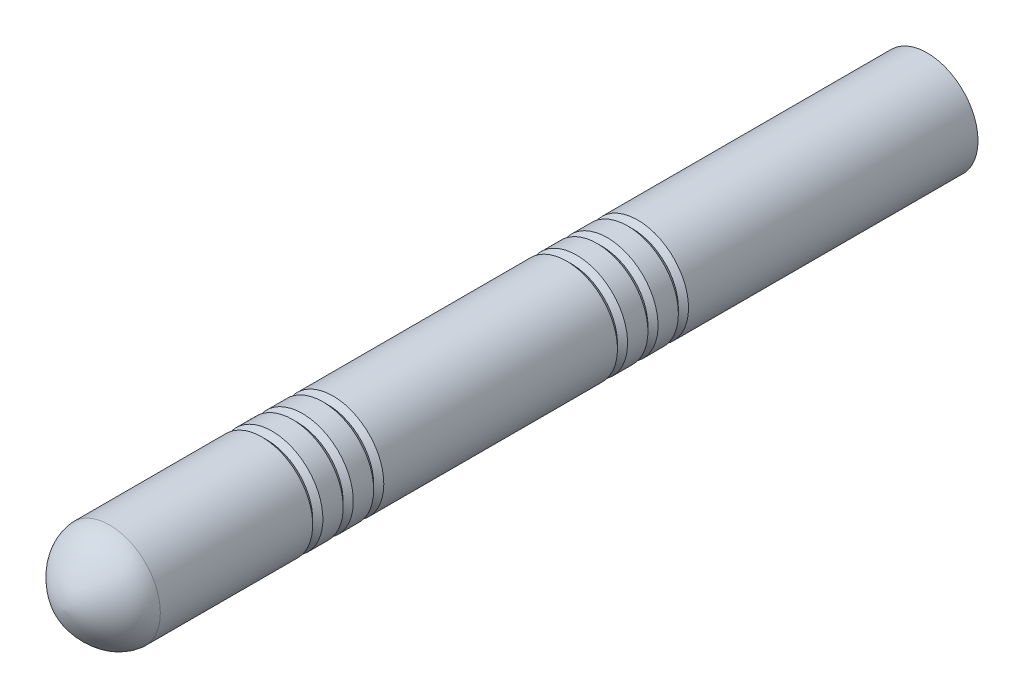
ISO-10303-21;
HEADER;
FILE_DESCRIPTION(('STEP AP214'),'2;1');
FILE_NAME('part.step','',(''),(''),'','','');
FILE_SCHEMA(('AUTOMOTIVE_DESIGN { 1 0 10303 214 1 1 1 1 }'));
ENDSEC;
DATA;
#1=APPLICATION_CONTEXT('core data for automotive mechanical design processes');
#2=APPLICATION_PROTOCOL_DEFINITION('international standard','automotive_design',2000,#1);
#3=PRODUCT_CONTEXT('',#1,'mechanical');
#4=PRODUCT('Part','Part','',(#3));
#5=PRODUCT_RELATED_PRODUCT_CATEGORY('part','',(#4));
#6=PRODUCT_DEFINITION_FORMATION('','',#4);
#7=PRODUCT_DEFINITION_CONTEXT('part definition',#1,'design');
#8=PRODUCT_DEFINITION('design','',#6,#7);
#9=PRODUCT_DEFINITION_SHAPE('','',#8);
#10=(LENGTH_UNIT() NAMED_UNIT(*) SI_UNIT(.MILLI.,.METRE.));
#11=(NAMED_UNIT(*) PLANE_ANGLE_UNIT() SI_UNIT($,.RADIAN.));
#12=(NAMED_UNIT(*) SI_UNIT($,.STERADIAN.) SOLID_ANGLE_UNIT());
#13=UNCERTAINTY_MEASURE_WITH_UNIT(LENGTH_MEASURE(1.E-05),#10,'distance_accuracy_value','');
#14=(GEOMETRIC_REPRESENTATION_CONTEXT(3) GLOBAL_UNCERTAINTY_ASSIGNED_CONTEXT((#13)) GLOBAL_UNIT_ASSIGNED_CONTEXT((#10,
#11,#12)) REPRESENTATION_CONTEXT('',''));
#15=CARTESIAN_POINT('',(0.,0.,0.));
#16=DIRECTION('',(0.,0.,1.));
#17=DIRECTION('',(1.,0.,0.));
#18=AXIS2_PLACEMENT_3D('',#15,#16,#17);
#19=CARTESIAN_POINT('',(0.,0.,80.5));
#20=DIRECTION('',(0.,0.,-1.));
#21=DIRECTION('',(-1.,0.,0.));
#22=AXIS2_PLACEMENT_3D('',#19,#20,#21);
#23=CYLINDRICAL_SURFACE('',#22,5.);
#24=CARTESIAN_POINT('',(0.,0.,35.5));
#25=DIRECTION('',(0.,0.,-1.));
#26=DIRECTION('',(-1.,0.,0.));
#27=AXIS2_PLACEMENT_3D('',#24,#25,#26);
#28=CIRCLE('',#27,5.);
#29=CARTESIAN_POINT('',(-5.,0.,35.5));
#30=VERTEX_POINT('',#29);
#31=EDGE_CURVE('E206',#30,#30,#28,.T.);
#32=ORIENTED_EDGE('',*,*,#31,.F.);
#33=EDGE_LOOP('',(#32));
#34=FACE_BOUND('',#33,.T.);
#35=CARTESIAN_POINT('',(0.,0.,58.5));
#36=DIRECTION('',(0.,0.,1.));
#37=DIRECTION('',(1.,0.,0.));
#38=AXIS2_PLACEMENT_3D('',#35,#36,#37);
#39=CIRCLE('',#38,5.);
#40=CARTESIAN_POINT('',(5.,0.,58.5));
#41=VERTEX_POINT('',#40);
#42=EDGE_CURVE('E191',#41,#41,#39,.T.);
#43=ORIENTED_EDGE('',*,*,#42,.F.);
#44=EDGE_LOOP('',(#43));
#45=FACE_BOUND('',#44,.T.);
#46=ADVANCED_FACE('F43',(#34,#45),#23,.T.);
#47=CARTESIAN_POINT('',(0.,0.,31.5));
#48=DIRECTION('',(0.,0.,-1.));
#49=DIRECTION('',(-1.,0.,0.));
#50=AXIS2_PLACEMENT_3D('',#47,#48,#49);
#51=CIRCLE('',#50,5.);
#52=CARTESIAN_POINT('',(-5.,0.,31.5));
#53=VERTEX_POINT('',#52);
#54=EDGE_CURVE('E209',#53,#53,#51,.T.);
#55=ORIENTED_EDGE('',*,*,#54,.T.);
#56=EDGE_LOOP('',(#55));
#57=FACE_BOUND('',#56,.T.);
#58=CARTESIAN_POINT('',(0.,0.,29.5));
#59=DIRECTION('',(0.,0.,1.));
#60=DIRECTION('',(1.,0.,0.));
#61=AXIS2_PLACEMENT_3D('',#58,#59,#60);
#62=CIRCLE('',#61,5.);
#63=CARTESIAN_POINT('',(5.,0.,29.5));
#64=VERTEX_POINT('',#63);
#65=EDGE_CURVE('E224',#64,#64,#62,.T.);
#66=ORIENTED_EDGE('',*,*,#65,.T.);
#67=EDGE_LOOP('',(#66));
#68=FACE_BOUND('',#67,.T.);
#69=ADVANCED_FACE('F45',(#57,#68),#23,.T.);
#70=CARTESIAN_POINT('',(0.,0.,29.5));
#71=DIRECTION('',(0.,0.,1.));
#72=DIRECTION('',(1.,0.,0.));
#73=AXIS2_PLACEMENT_3D('',#70,#71,#72);
#74=CONICAL_SURFACE('',#73,5.,0.785398163397449);
#75=CARTESIAN_POINT('',(0.,0.,29.));
#76=DIRECTION('',(0.,0.,1.));
#77=DIRECTION('',(1.,0.,0.));
#78=AXIS2_PLACEMENT_3D('',#75,#76,#77);
#79=CIRCLE('',#78,4.5);
#80=CARTESIAN_POINT('',(4.5,0.,29.));
#81=VERTEX_POINT('',#80);
#82=EDGE_CURVE('E221',#81,#81,#79,.T.);
#83=ORIENTED_EDGE('',*,*,#82,.T.);
#84=EDGE_LOOP('',(#83));
#85=FACE_BOUND('',#84,.T.);
#86=ORIENTED_EDGE('',*,*,#65,.F.);
#87=EDGE_LOOP('',(#86));
#88=FACE_BOUND('',#87,.T.);
#89=ADVANCED_FACE('F136',(#85,#88),#74,.T.);
#90=CARTESIAN_POINT('',(0.,0.,29.));
#91=DIRECTION('',(0.,0.,-1.));
#92=DIRECTION('',(-1.,0.,0.));
#93=AXIS2_PLACEMENT_3D('',#90,#91,#92);
#94=CONICAL_SURFACE('',#93,4.5,0.785398163397449);
#95=CARTESIAN_POINT('',(0.,0.,28.5));
#96=DIRECTION('',(0.,0.,1.));
#97=DIRECTION('',(1.,0.,0.));
#98=AXIS2_PLACEMENT_3D('',#95,#96,#97);
#99=CIRCLE('',#98,5.);
#100=CARTESIAN_POINT('',(5.,0.,28.5));
#101=VERTEX_POINT('',#100);
#102=EDGE_CURVE('E218',#101,#101,#99,.T.);
#103=ORIENTED_EDGE('',*,*,#102,.T.);
#104=EDGE_LOOP('',(#103));
#105=FACE_BOUND('',#104,.T.);
#106=ORIENTED_EDGE('',*,*,#82,.F.);
#107=EDGE_LOOP('',(#106));
#108=FACE_BOUND('',#107,.T.);
#109=ADVANCED_FACE('F132',(#105,#108),#94,.T.);
#110=CARTESIAN_POINT('',(0.,0.,0.));
#111=DIRECTION('',(0.,0.,1.));
#112=DIRECTION('',(1.,0.,0.));
#113=AXIS2_PLACEMENT_3D('',#110,#111,#112);
#114=PLANE('',#113);
#115=CARTESIAN_POINT('',(0.,0.,0.));
#116=DIRECTION('',(0.,0.,-1.));
#117=DIRECTION('',(-1.,0.,0.));
#118=AXIS2_PLACEMENT_3D('',#115,#116,#117);
#119=CIRCLE('',#118,3.39999999999999);
#120=CARTESIAN_POINT('',(-3.39999999999999,0.,0.));
#121=VERTEX_POINT('',#120);
#122=EDGE_CURVE('E68',#121,#121,#119,.T.);
#123=ORIENTED_EDGE('',*,*,#122,.F.);
#124=EDGE_LOOP('',(#123));
#125=FACE_BOUND('',#124,.T.);
#126=CARTESIAN_POINT('',(0.,0.,0.));
#127=DIRECTION('',(0.,0.,1.));
#128=DIRECTION('',(1.,0.,0.));
#129=AXIS2_PLACEMENT_3D('',#126,#127,#128);
#130=CIRCLE('',#129,5.);
#131=CARTESIAN_POINT('',(5.,0.,0.));
#132=VERTEX_POINT('',#131);
#133=EDGE_CURVE('E47',#132,#132,#130,.T.);
#134=ORIENTED_EDGE('',*,*,#133,.F.);
#135=EDGE_LOOP('',(#134));
#136=FACE_BOUND('',#135,.T.);
#137=ADVANCED_FACE('F135',(#125,#136),#114,.F.);
#138=ORIENTED_EDGE('',*,*,#133,.T.);
#139=EDGE_LOOP('',(#138));
#140=FACE_BOUND('',#139,.T.);
#141=ORIENTED_EDGE('',*,*,#102,.F.);
#142=EDGE_LOOP('',(#141));
#143=FACE_BOUND('',#142,.T.);
#144=ADVANCED_FACE('F130',(#140,#143),#23,.T.);
#145=CARTESIAN_POINT('',(0.,0.,32.5));
#146=DIRECTION('',(0.,0.,1.));
#147=DIRECTION('',(1.,0.,0.));
#148=AXIS2_PLACEMENT_3D('',#145,#146,#147);
#149=CONICAL_SURFACE('',#148,5.,0.785398163397446);
#150=CARTESIAN_POINT('',(0.,0.,32.));
#151=DIRECTION('',(0.,0.,-1.));
#152=DIRECTION('',(-1.,0.,0.));
#153=AXIS2_PLACEMENT_3D('',#150,#151,#152);
#154=CIRCLE('',#153,4.5);
#155=CARTESIAN_POINT('',(-4.5,0.,32.));
#156=VERTEX_POINT('',#155);
#157=EDGE_CURVE('E212',#156,#156,#154,.T.);
#158=ORIENTED_EDGE('',*,*,#157,.F.);
#159=EDGE_LOOP('',(#158));
#160=FACE_BOUND('',#159,.T.);
#161=CARTESIAN_POINT('',(0.,0.,32.5));
#162=DIRECTION('',(0.,0.,-1.));
#163=DIRECTION('',(-1.,0.,0.));
#164=AXIS2_PLACEMENT_3D('',#161,#162,#163);
#165=CIRCLE('',#164,5.);
#166=CARTESIAN_POINT('',(-5.,0.,32.5));
#167=VERTEX_POINT('',#166);
#168=EDGE_CURVE('E215',#167,#167,#165,.T.);
#169=ORIENTED_EDGE('',*,*,#168,.T.);
#170=EDGE_LOOP('',(#169));
#171=FACE_BOUND('',#170,.T.);
#172=ADVANCED_FACE('F126',(#160,#171),#149,.T.);
#173=CARTESIAN_POINT('',(0.,0.,32.));
#174=DIRECTION('',(0.,0.,-1.));
#175=DIRECTION('',(-1.,0.,0.));
#176=AXIS2_PLACEMENT_3D('',#173,#174,#175);
#177=CONICAL_SURFACE('',#176,4.5,0.785398163397446);
#178=ORIENTED_EDGE('',*,*,#54,.F.);
#179=EDGE_LOOP('',(#178));
#180=FACE_BOUND('',#179,.T.);
#181=ORIENTED_EDGE('',*,*,#157,.T.);
#182=EDGE_LOOP('',(#181));
#183=FACE_BOUND('',#182,.T.);
#184=ADVANCED_FACE('F123',(#180,#183),#177,.T.);
#185=CARTESIAN_POINT('',(0.,0.,34.5));
#186=DIRECTION('',(0.,0.,-1.));
#187=DIRECTION('',(-1.,0.,0.));
#188=AXIS2_PLACEMENT_3D('',#185,#186,#187);
#189=CIRCLE('',#188,5.);
#190=CARTESIAN_POINT('',(-5.,0.,34.5));
#191=VERTEX_POINT('',#190);
#192=EDGE_CURVE('E200',#191,#191,#189,.T.);
#193=ORIENTED_EDGE('',*,*,#192,.T.);
#194=EDGE_LOOP('',(#193));
#195=FACE_BOUND('',#194,.T.);
#196=ORIENTED_EDGE('',*,*,#168,.F.);
#197=EDGE_LOOP('',(#196));
#198=FACE_BOUND('',#197,.T.);
#199=ADVANCED_FACE('F121',(#195,#198),#23,.T.);
#200=CARTESIAN_POINT('',(0.,0.,35.5));
#201=DIRECTION('',(0.,0.,1.));
#202=DIRECTION('',(1.,0.,0.));
#203=AXIS2_PLACEMENT_3D('',#200,#201,#202);
#204=CONICAL_SURFACE('',#203,5.,0.785398163397449);
#205=CARTESIAN_POINT('',(0.,0.,35.));
#206=DIRECTION('',(0.,0.,-1.));
#207=DIRECTION('',(-1.,0.,0.));
#208=AXIS2_PLACEMENT_3D('',#205,#206,#207);
#209=CIRCLE('',#208,4.5);
#210=CARTESIAN_POINT('',(-4.5,0.,35.));
#211=VERTEX_POINT('',#210);
#212=EDGE_CURVE('E203',#211,#211,#209,.T.);
#213=ORIENTED_EDGE('',*,*,#212,.F.);
#214=EDGE_LOOP('',(#213));
#215=FACE_BOUND('',#214,.T.);
#216=ORIENTED_EDGE('',*,*,#31,.T.);
#217=EDGE_LOOP('',(#216));
#218=FACE_BOUND('',#217,.T.);
#219=ADVANCED_FACE('F117',(#215,#218),#204,.T.);
#220=CARTESIAN_POINT('',(0.,0.,35.));
#221=DIRECTION('',(0.,0.,-1.));
#222=DIRECTION('',(-1.,0.,0.));
#223=AXIS2_PLACEMENT_3D('',#220,#221,#222);
#224=CONICAL_SURFACE('',#223,4.5,0.785398163397449);
#225=ORIENTED_EDGE('',*,*,#192,.F.);
#226=EDGE_LOOP('',(#225));
#227=FACE_BOUND('',#226,.T.);
#228=ORIENTED_EDGE('',*,*,#212,.T.);
#229=EDGE_LOOP('',(#228));
#230=FACE_BOUND('',#229,.T.);
#231=ADVANCED_FACE('F113',(#227,#230),#224,.T.);
#232=CARTESIAN_POINT('',(0.,0.,59.5));
#233=DIRECTION('',(0.,0.,1.));
#234=DIRECTION('',(1.,0.,0.));
#235=AXIS2_PLACEMENT_3D('',#232,#233,#234);
#236=CONICAL_SURFACE('',#235,5.,0.785398163397449);
#237=CARTESIAN_POINT('',(0.,0.,59.));
#238=DIRECTION('',(0.,0.,1.));
#239=DIRECTION('',(1.,0.,0.));
#240=AXIS2_PLACEMENT_3D('',#237,#238,#239);
#241=CIRCLE('',#240,4.5);
#242=CARTESIAN_POINT('',(4.5,0.,59.));
#243=VERTEX_POINT('',#242);
#244=EDGE_CURVE('E194',#243,#243,#241,.T.);
#245=ORIENTED_EDGE('',*,*,#244,.T.);
#246=EDGE_LOOP('',(#245));
#247=FACE_BOUND('',#246,.T.);
#248=CARTESIAN_POINT('',(0.,0.,59.5));
#249=DIRECTION('',(0.,0.,1.));
#250=DIRECTION('',(1.,0.,0.));
#251=AXIS2_PLACEMENT_3D('',#248,#249,#250);
#252=CIRCLE('',#251,5.);
#253=CARTESIAN_POINT('',(5.,0.,59.5));
#254=VERTEX_POINT('',#253);
#255=EDGE_CURVE('E197',#254,#254,#252,.T.);
#256=ORIENTED_EDGE('',*,*,#255,.F.);
#257=EDGE_LOOP('',(#256));
#258=FACE_BOUND('',#257,.T.);
#259=ADVANCED_FACE('F109',(#247,#258),#236,.T.);
#260=CARTESIAN_POINT('',(0.,0.,59.));
#261=DIRECTION('',(0.,0.,-1.));
#262=DIRECTION('',(-1.,0.,0.));
#263=AXIS2_PLACEMENT_3D('',#260,#261,#262);
#264=CONICAL_SURFACE('',#263,4.5,0.785398163397449);
#265=ORIENTED_EDGE('',*,*,#42,.T.);
#266=EDGE_LOOP('',(#265));
#267=FACE_BOUND('',#266,.T.);
#268=ORIENTED_EDGE('',*,*,#244,.F.);
#269=EDGE_LOOP('',(#268));
#270=FACE_BOUND('',#269,.T.);
#271=ADVANCED_FACE('F106',(#267,#270),#264,.T.);
#272=CARTESIAN_POINT('',(0.,0.,61.5));
#273=DIRECTION('',(0.,0.,-1.));
#274=DIRECTION('',(-1.,0.,0.));
#275=AXIS2_PLACEMENT_3D('',#272,#273,#274);
#276=CIRCLE('',#275,5.);
#277=CARTESIAN_POINT('',(-5.,0.,61.5));
#278=VERTEX_POINT('',#277);
#279=EDGE_CURVE('E180',#278,#278,#276,.T.);
#280=ORIENTED_EDGE('',*,*,#279,.T.);
#281=EDGE_LOOP('',(#280));
#282=FACE_BOUND('',#281,.T.);
#283=ORIENTED_EDGE('',*,*,#255,.T.);
#284=EDGE_LOOP('',(#283));
#285=FACE_BOUND('',#284,.T.);
#286=ADVANCED_FACE('F104',(#282,#285),#23,.T.);
#287=CARTESIAN_POINT('',(0.,0.,62.5));
#288=DIRECTION('',(0.,0.,1.));
#289=DIRECTION('',(1.,0.,0.));
#290=AXIS2_PLACEMENT_3D('',#287,#288,#289);
#291=CONICAL_SURFACE('',#290,5.,0.785398163397446);
#292=CARTESIAN_POINT('',(0.,0.,62.));
#293=DIRECTION('',(0.,0.,-1.));
#294=DIRECTION('',(-1.,0.,0.));
#295=AXIS2_PLACEMENT_3D('',#292,#293,#294);
#296=CIRCLE('',#295,4.5);
#297=CARTESIAN_POINT('',(-4.5,0.,62.));
#298=VERTEX_POINT('',#297);
#299=EDGE_CURVE('E182',#298,#298,#296,.T.);
#300=ORIENTED_EDGE('',*,*,#299,.F.);
#301=EDGE_LOOP('',(#300));
#302=FACE_BOUND('',#301,.T.);
#303=CARTESIAN_POINT('',(0.,0.,62.5));
#304=DIRECTION('',(0.,0.,-1.));
#305=DIRECTION('',(-1.,0.,0.));
#306=AXIS2_PLACEMENT_3D('',#303,#304,#305);
#307=CIRCLE('',#306,5.);
#308=CARTESIAN_POINT('',(-5.,0.,62.5));
#309=VERTEX_POINT('',#308);
#310=EDGE_CURVE('E188',#309,#309,#307,.T.);
#311=ORIENTED_EDGE('',*,*,#310,.T.);
#312=EDGE_LOOP('',(#311));
#313=FACE_BOUND('',#312,.T.);
#314=ADVANCED_FACE('F100',(#302,#313),#291,.T.);
#315=CARTESIAN_POINT('',(0.,0.,62.));
#316=DIRECTION('',(0.,0.,-1.));
#317=DIRECTION('',(-1.,0.,0.));
#318=AXIS2_PLACEMENT_3D('',#315,#316,#317);
#319=CONICAL_SURFACE('',#318,4.5,0.785398163397446);
#320=ORIENTED_EDGE('',*,*,#279,.F.);
#321=EDGE_LOOP('',(#320));
#322=FACE_BOUND('',#321,.T.);
#323=ORIENTED_EDGE('',*,*,#299,.T.);
#324=EDGE_LOOP('',(#323));
#325=FACE_BOUND('',#324,.T.);
#326=ADVANCED_FACE('F97',(#322,#325),#319,.T.);
#327=CARTESIAN_POINT('',(0.,0.,64.5));
#328=DIRECTION('',(0.,0.,-1.));
#329=DIRECTION('',(-1.,0.,0.));
#330=AXIS2_PLACEMENT_3D('',#327,#328,#329);
#331=CIRCLE('',#330,5.);
#332=CARTESIAN_POINT('',(-5.,0.,64.5));
#333=VERTEX_POINT('',#332);
#334=EDGE_CURVE('E67',#333,#333,#331,.T.);
#335=ORIENTED_EDGE('',*,*,#334,.T.);
#336=EDGE_LOOP('',(#335));
#337=FACE_BOUND('',#336,.T.);
#338=ORIENTED_EDGE('',*,*,#310,.F.);
#339=EDGE_LOOP('',(#338));
#340=FACE_BOUND('',#339,.T.);
#341=ADVANCED_FACE('F95',(#337,#340),#23,.T.);
#342=CARTESIAN_POINT('',(0.,0.,65.5));
#343=DIRECTION('',(0.,0.,1.));
#344=DIRECTION('',(1.,0.,0.));
#345=AXIS2_PLACEMENT_3D('',#342,#343,#344);
#346=CONICAL_SURFACE('',#345,5.,0.785398163397449);
#347=CARTESIAN_POINT('',(0.,0.,65.));
#348=DIRECTION('',(0.,0.,-1.));
#349=DIRECTION('',(-1.,0.,0.));
#350=AXIS2_PLACEMENT_3D('',#347,#348,#349);
#351=CIRCLE('',#350,4.5);
#352=CARTESIAN_POINT('',(-4.5,0.,65.));
#353=VERTEX_POINT('',#352);
#354=EDGE_CURVE('E71',#353,#353,#351,.T.);
#355=ORIENTED_EDGE('',*,*,#354,.F.);
#356=EDGE_LOOP('',(#355));
#357=FACE_BOUND('',#356,.T.);
#358=CARTESIAN_POINT('',(0.,0.,65.5));
#359=DIRECTION('',(0.,0.,-1.));
#360=DIRECTION('',(-1.,0.,0.));
#361=AXIS2_PLACEMENT_3D('',#358,#359,#360);
#362=CIRCLE('',#361,5.);
#363=CARTESIAN_POINT('',(-5.,0.,65.5));
#364=VERTEX_POINT('',#363);
#365=EDGE_CURVE('E176',#364,#364,#362,.T.);
#366=ORIENTED_EDGE('',*,*,#365,.T.);
#367=EDGE_LOOP('',(#366));
#368=FACE_BOUND('',#367,.T.);
#369=ADVANCED_FACE('F91',(#357,#368),#346,.T.);
#370=CARTESIAN_POINT('',(0.,0.,65.));
#371=DIRECTION('',(0.,0.,-1.));
#372=DIRECTION('',(-1.,0.,0.));
#373=AXIS2_PLACEMENT_3D('',#370,#371,#372);
#374=CONICAL_SURFACE('',#373,4.5,0.785398163397449);
#375=ORIENTED_EDGE('',*,*,#334,.F.);
#376=EDGE_LOOP('',(#375));
#377=FACE_BOUND('',#376,.T.);
#378=ORIENTED_EDGE('',*,*,#354,.T.);
#379=EDGE_LOOP('',(#378));
#380=FACE_BOUND('',#379,.T.);
#381=ADVANCED_FACE('F88',(#377,#380),#374,.T.);
#382=ORIENTED_EDGE('',*,*,#365,.F.);
#383=EDGE_LOOP('',(#382));
#384=FACE_BOUND('',#383,.T.);
#385=CARTESIAN_POINT('',(0.,0.,80.5));
#386=DIRECTION('',(0.,0.,1.));
#387=DIRECTION('',(1.,0.,0.));
#388=AXIS2_PLACEMENT_3D('',#385,#386,#387);
#389=CIRCLE('',#388,5.);
#390=CARTESIAN_POINT('',(5.,0.,80.5));
#391=VERTEX_POINT('',#390);
#392=EDGE_CURVE('E11',#391,#391,#389,.T.);
#393=ORIENTED_EDGE('',*,*,#392,.F.);
#394=EDGE_LOOP('',(#393));
#395=FACE_BOUND('',#394,.T.);
#396=ADVANCED_FACE('F86',(#384,#395),#23,.T.);
#397=CARTESIAN_POINT('',(0.,5.,80.5));
#398=CARTESIAN_POINT('',(0.,4.88754630798113,81.8089022315402));
#399=CARTESIAN_POINT('',(0.,3.31859514781799,83.7606856105868));
#400=CARTESIAN_POINT('',(0.,1.17869740330413,84.9083525825409));
#401=CARTESIAN_POINT('',(0.,0.,85.));
#402=B_SPLINE_CURVE_WITH_KNOTS('',3,(#397,#398,#399,#400,#401),.UNSPECIFIED.,.F.,.F.,(4,1,4),
(0.,0.522008980306597,1.),.UNSPECIFIED.);
#403=CARTESIAN_POINT('',(0.,0.,87.7827861625226));
#404=DIRECTION('',(0.,0.,1.));
#405=AXIS1_PLACEMENT('',#403,#404);
#406=SURFACE_OF_REVOLUTION('',#402,#405);
#407=CARTESIAN_POINT('',(0.,0.,85.));
#408=VERTEX_POINT('',#407);
#409=VERTEX_LOOP('',#408);
#410=FACE_BOUND('',#409,.T.);
#411=ORIENTED_EDGE('',*,*,#392,.T.);
#412=EDGE_LOOP('',(#411));
#413=FACE_BOUND('',#412,.T.);
#414=ADVANCED_FACE('F61',(#410,#413),#406,.T.);
#415=CARTESIAN_POINT('',(0.,0.,67.07));
#416=DIRECTION('',(0.,0.,-1.));
#417=DIRECTION('',(-1.,0.,0.));
#418=AXIS2_PLACEMENT_3D('',#415,#416,#417);
#419=CONICAL_SURFACE('',#418,3.39999999999998,1.04719755119659);
#420=CARTESIAN_POINT('',(0.,0.,69.0329909152447));
#421=VERTEX_POINT('',#420);
#422=VERTEX_LOOP('',#421);
#423=FACE_BOUND('',#422,.T.);
#424=CARTESIAN_POINT('',(0.,0.,67.07));
#425=DIRECTION('',(0.,0.,-1.));
#426=DIRECTION('',(-1.,0.,0.));
#427=AXIS2_PLACEMENT_3D('',#424,#425,#426);
#428=CIRCLE('',#427,3.39999999999998);
#429=CARTESIAN_POINT('',(-3.39999999999998,0.,67.07));
#430=VERTEX_POINT('',#429);
#431=EDGE_CURVE('E65',#430,#430,#428,.T.);
#432=ORIENTED_EDGE('',*,*,#431,.T.);
#433=EDGE_LOOP('',(#432));
#434=FACE_BOUND('',#433,.T.);
#435=ADVANCED_FACE('F57',(#423,#434),#419,.F.);
#436=CARTESIAN_POINT('',(0.,0.,0.));
#437=DIRECTION('',(0.,0.,-1.));
#438=DIRECTION('',(-1.,0.,0.));
#439=AXIS2_PLACEMENT_3D('',#436,#437,#438);
#440=CYLINDRICAL_SURFACE('',#439,3.39999999999999);
#441=ORIENTED_EDGE('',*,*,#431,.F.);
#442=EDGE_LOOP('',(#441));
#443=FACE_BOUND('',#442,.T.);
#444=ORIENTED_EDGE('',*,*,#122,.T.);
#445=EDGE_LOOP('',(#444));
#446=FACE_BOUND('',#445,.T.);
#447=ADVANCED_FACE('F60',(#443,#446),#440,.F.);
#448=CLOSED_SHELL('',(#46,#69,#89,#109,#137,#144,#172,#184,#199,#219,#231,#259,#271,#286,#314,
#326,#341,#369,#381,#396,#414,#435,#447));
#449=MANIFOLD_SOLID_BREP('B2',#448);
#450=ADVANCED_BREP_SHAPE_REPRESENTATION('',(#18,#449),#14);
#451=SHAPE_DEFINITION_REPRESENTATION(#9,#450);
ENDSEC;
END-ISO-10303-21;
